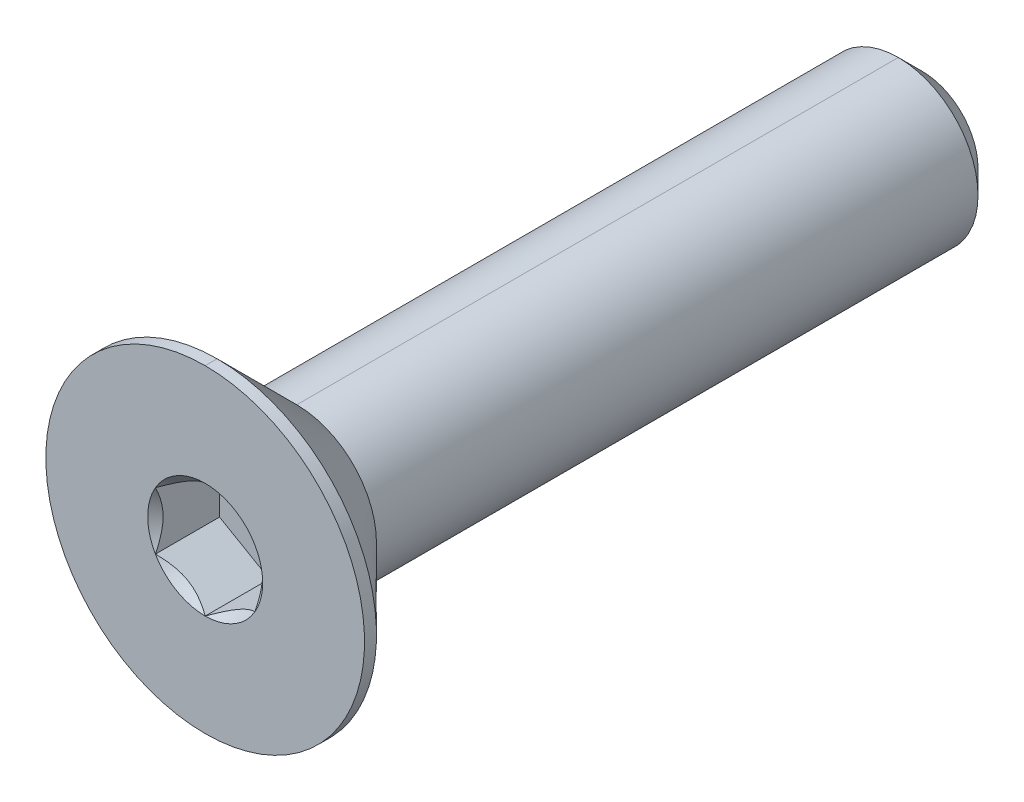
ISO-10303-21;
HEADER;
FILE_DESCRIPTION(('STEP AP214'),'2;1');
FILE_NAME('part.step','',(''),(''),'','','');
FILE_SCHEMA(('AUTOMOTIVE_DESIGN { 1 0 10303 214 1 1 1 1 }'));
ENDSEC;
DATA;
#1=APPLICATION_CONTEXT('core data for automotive mechanical design processes');
#2=APPLICATION_PROTOCOL_DEFINITION('international standard','automotive_design',2000,#1);
#3=PRODUCT_CONTEXT('',#1,'mechanical');
#4=PRODUCT('Part','Part','',(#3));
#5=PRODUCT_RELATED_PRODUCT_CATEGORY('part','',(#4));
#6=PRODUCT_DEFINITION_FORMATION('','',#4);
#7=PRODUCT_DEFINITION_CONTEXT('part definition',#1,'design');
#8=PRODUCT_DEFINITION('design','',#6,#7);
#9=PRODUCT_DEFINITION_SHAPE('','',#8);
#10=(LENGTH_UNIT() NAMED_UNIT(*) SI_UNIT(.MILLI.,.METRE.));
#11=(NAMED_UNIT(*) PLANE_ANGLE_UNIT() SI_UNIT($,.RADIAN.));
#12=(NAMED_UNIT(*) SI_UNIT($,.STERADIAN.) SOLID_ANGLE_UNIT());
#13=UNCERTAINTY_MEASURE_WITH_UNIT(LENGTH_MEASURE(1.E-05),#10,'distance_accuracy_value','');
#14=(GEOMETRIC_REPRESENTATION_CONTEXT(3) GLOBAL_UNCERTAINTY_ASSIGNED_CONTEXT((#13)) GLOBAL_UNIT_ASSIGNED_CONTEXT((#10,
#11,#12)) REPRESENTATION_CONTEXT('',''));
#15=CARTESIAN_POINT('',(0.,0.,0.));
#16=DIRECTION('',(0.,0.,1.));
#17=DIRECTION('',(1.,0.,0.));
#18=AXIS2_PLACEMENT_3D('',#15,#16,#17);
#19=CARTESIAN_POINT('',(0.,0.,9.));
#20=DIRECTION('',(0.,0.,1.));
#21=DIRECTION('',(1.,0.,0.));
#22=AXIS2_PLACEMENT_3D('',#19,#20,#21);
#23=CONICAL_SURFACE('',#22,1.44337567297406,0.78539816339745);
#24=CARTESIAN_POINT('',(0.,1.44337567297407,9.));
#25=CARTESIAN_POINT('',(0.0253962062772441,1.42871173939538,8.98534017344977));
#26=CARTESIAN_POINT('',(0.051025697636328,1.41390821556327,8.97120285583119));
#27=CARTESIAN_POINT('',(0.10185264126638,1.38455135148814,8.94467796047015));
#28=CARTESIAN_POINT('',(0.127032720413157,1.3700080230413,8.93224586501801));
#29=CARTESIAN_POINT('',(0.177081701669524,1.34111080255659,8.90912487306404));
#30=CARTESIAN_POINT('',(0.201935690514344,1.32676522024172,8.89839360591218));
#31=CARTESIAN_POINT('',(0.25146253920529,1.29818727047121,8.8786765587831));
#32=CARTESIAN_POINT('',(0.276124071878939,1.28396122168207,8.8696534859));
#33=CARTESIAN_POINT('',(0.31452641800861,1.26178056656594,8.85692893897715));
#34=CARTESIAN_POINT('',(0.328136143311492,1.25391439326372,8.8526727508192));
#35=CARTESIAN_POINT('',(0.355229451392081,1.23824608018625,8.84472997992978));
#36=CARTESIAN_POINT('',(0.368711226503257,1.2304451365734,8.84103492017969));
#37=CARTESIAN_POINT('',(0.395584933976844,1.21489851618412,8.83421571559464));
#38=CARTESIAN_POINT('',(0.408975452422273,1.20715361127104,8.83108425485051));
#39=CARTESIAN_POINT('',(0.435700897895861,1.19170446214963,8.82539033599572));
#40=CARTESIAN_POINT('',(0.449034857317323,1.18400068549077,8.82282208479103));
#41=CARTESIAN_POINT('',(0.475681276528109,1.16861644528848,8.81825316135381));
#42=CARTESIAN_POINT('',(0.48899318756872,1.16093621958652,8.81624849760021));
#43=CARTESIAN_POINT('',(0.515628569335448,1.1455779145886,8.8128046644906));
#44=CARTESIAN_POINT('',(0.528951836856391,1.13789992170302,8.8113635421712));
#45=CARTESIAN_POINT('',(0.55564234252192,1.1225220212383,8.80904523720888));
#46=CARTESIAN_POINT('',(0.569009596947596,1.1148221057322,8.80816829450218));
#47=CARTESIAN_POINT('',(0.595817844537591,1.09937057070431,8.8069740767474));
#48=CARTESIAN_POINT('',(0.609258902931849,1.09161887291294,8.80665928676263));
#49=CARTESIAN_POINT('',(0.636054452770437,1.07615046580358,8.80659521746844));
#50=CARTESIAN_POINT('',(0.649408976697644,1.0684338279729,8.80684253373492));
#51=CARTESIAN_POINT('',(0.676066182787152,1.05303545315484,8.80790893010388));
#52=CARTESIAN_POINT('',(0.689368906228141,1.04535367864985,8.80872642828909));
#53=CARTESIAN_POINT('',(0.71596024455312,1.03000750613394,8.81092883063313));
#54=CARTESIAN_POINT('',(0.729248819096024,1.022343143325,8.81231446543181));
#55=CARTESIAN_POINT('',(0.755848733765951,1.00701331189659,8.81565134115995));
#56=CARTESIAN_POINT('',(0.769159822872786,0.999348051623459,8.81760553341166));
#57=CARTESIAN_POINT('',(0.795839026849609,0.983994593890452,8.82207725389689));
#58=CARTESIAN_POINT('',(0.809206551473541,0.976306826796834,8.82459976623489));
#59=CARTESIAN_POINT('',(0.836030433544912,0.960883817247543,8.83020594809084));
#60=CARTESIAN_POINT('',(0.849485747047036,0.953149221289952,8.83329636920177));
#61=CARTESIAN_POINT('',(0.87651494201565,0.937606876871419,8.84003762359308));
#62=CARTESIAN_POINT('',(0.890087243379552,0.92979995626365,8.84369668033761));
#63=CARTESIAN_POINT('',(0.917375633781641,0.914080846260019,8.85157025043506));
#64=CARTESIAN_POINT('',(0.931089512921074,0.906169496813148,8.85579404361733));
#65=CARTESIAN_POINT('',(0.970039852544219,0.883668662016082,8.86851711600208));
#66=CARTESIAN_POINT('',(0.99512579099531,0.869139636793051,8.87758988234929));
#67=CARTESIAN_POINT('',(1.04544920087651,0.839994058447102,8.89744085354636));
#68=CARTESIAN_POINT('',(1.07067614496204,0.825383608034289,8.9082544157871));
#69=CARTESIAN_POINT('',(1.12142938776406,0.796003215878353,8.93157106751197));
#70=CARTESIAN_POINT('',(1.14694156254262,0.78124187520054,8.94411545023976));
#71=CARTESIAN_POINT('',(1.19839367046888,0.751491912393512,8.97089507014338));
#72=CARTESIAN_POINT('',(1.22431675063714,0.736513757528845,8.98517445787383));
#73=CARTESIAN_POINT('',(1.25,0.721687836487039,9.));
#74=B_SPLINE_CURVE_WITH_KNOTS('',3,(#24,#25,#26,#27,#28,#29,#30,#31,#32,#33,#34,#35,#36,#37,#38,
#39,#40,#41,#42,#43,#44,#45,#46,#47,#48,#49,#50,#51,#52,#53,#54,#55,#56,#57,#58,#59,#60,#61,#62,
#63,#64,#65,#66,#67,#68,#69,#70,#71,#72,#73),.UNSPECIFIED.,.F.,.F.,(4,2,2,2,2,2,2,2,2,2,2,2,2,2,
2,2,2,2,2,2,2,2,2,2,4),(0.,0.0983661972934601,0.193211421660727,0.285089157764343,
0.374642306368989,0.423491865935605,0.471508249259108,0.518847537410274,0.565674322319022,
0.612160591590057,0.658484303052321,0.704827702218182,0.751375465487974,0.79764206173265,
0.843780803535172,0.889979068113249,0.93642155729171,0.983288395797251,1.03075343788103,
1.07898286243241,1.12813410356451,1.21921525270593,1.31245749510235,1.40852753786428,
1.50800018713207),.UNSPECIFIED.);
#75=CARTESIAN_POINT('',(0.,1.44337567297407,9.));
#76=VERTEX_POINT('',#75);
#77=CARTESIAN_POINT('',(1.25,0.721687836487039,9.));
#78=VERTEX_POINT('',#77);
#79=EDGE_CURVE('E693',#76,#78,#74,.T.);
#80=ORIENTED_EDGE('',*,*,#79,.T.);
#81=CARTESIAN_POINT('',(0.,0.,9.));
#82=DIRECTION('',(0.,0.,1.));
#83=DIRECTION('',(1.,0.,0.));
#84=AXIS2_PLACEMENT_3D('',#81,#82,#83);
#85=CIRCLE('',#84,1.44337567297406);
#86=EDGE_CURVE('E183',#78,#76,#85,.T.);
#87=ORIENTED_EDGE('',*,*,#86,.T.);
#88=EDGE_LOOP('',(#80,#87));
#89=FACE_BOUND('',#88,.T.);
#90=ADVANCED_FACE('F15',(#89),#23,.F.);
#91=CARTESIAN_POINT('',(0.,0.,9.));
#92=DIRECTION('',(0.,0.,1.));
#93=DIRECTION('',(1.,0.,0.));
#94=AXIS2_PLACEMENT_3D('',#91,#92,#93);
#95=CONICAL_SURFACE('',#94,1.44337567297406,0.78539816339745);
#96=CARTESIAN_POINT('',(-1.25,-0.721687836487021,9.));
#97=CARTESIAN_POINT('',(-1.24999872788529,-0.69213654778458,8.98522748872684));
#98=CARTESIAN_POINT('',(-1.24999292132122,-0.662309206776891,8.97098521795377));
#99=CARTESIAN_POINT('',(-1.24998193050169,-0.60316233993739,8.94427909897459));
#100=CARTESIAN_POINT('',(-1.24997673134818,-0.573863352445898,8.93176961075768));
#101=CARTESIAN_POINT('',(-1.24997524547517,-0.515634615633568,8.90852229969113));
#102=CARTESIAN_POINT('',(-1.24997868311047,-0.48672231796561,8.89774107477324));
#103=CARTESIAN_POINT('',(-1.24999358008267,-0.429112214247941,8.87795264012988));
#104=CARTESIAN_POINT('',(-1.25000483347911,-0.40042760879462,8.86890733031116));
#105=CARTESIAN_POINT('',(-1.24999738242329,-0.355858862897729,8.85620256871726));
#106=CARTESIAN_POINT('',(-1.24999004692363,-0.340135159435788,8.85197507733425));
#107=CARTESIAN_POINT('',(-1.24996755916747,-0.308829347908529,8.84409042944266));
#108=CARTESIAN_POINT('',(-1.24995254218589,-0.293249390048759,8.84042478470691));
#109=CARTESIAN_POINT('',(-1.24992539836196,-0.262195095998351,8.8336651858397));
#110=CARTESIAN_POINT('',(-1.24991323384715,-0.246722355439851,8.83056391729016));
#111=CARTESIAN_POINT('',(-1.24989633459076,-0.215845384547125,8.82493113810775));
#112=CARTESIAN_POINT('',(-1.24989152123761,-0.200442211230733,8.822393850632));
#113=CARTESIAN_POINT('',(-1.24989136166261,-0.169666036865271,8.81788756233859));
#114=CARTESIAN_POINT('',(-1.24989594752465,-0.154293617123322,8.81591460125972));
#115=CARTESIAN_POINT('',(-1.24991294760553,-0.123539603459818,8.81253500059749));
#116=CARTESIAN_POINT('',(-1.24992533506981,-0.108158219669015,8.81112645234014));
#117=CARTESIAN_POINT('',(-1.24995281607519,-0.0773460596479704,8.80887360704871));
#118=CARTESIAN_POINT('',(-1.24996791102917,-0.0619152617804686,8.80802960571176));
#119=CARTESIAN_POINT('',(-1.24999176536981,-0.030963474241291,8.80690344856759));
#120=CARTESIAN_POINT('',(-1.25000049582688,-0.0154423920415858,8.80662384817629));
#121=CARTESIAN_POINT('',(-1.24999950440626,0.0155924626689868,8.80662481060224));
#122=CARTESIAN_POINT('',(-1.24998979120314,0.0311062351852591,8.80690511008603));
#123=CARTESIAN_POINT('',(-1.24996490610343,0.0620454027735855,8.80803311536389));
#124=CARTESIAN_POINT('',(-1.24994975823008,0.0774708879324943,8.80887833795984));
#125=CARTESIAN_POINT('',(-1.2499225741517,0.108274457028532,8.81113376950202));
#126=CARTESIAN_POINT('',(-1.2499105367446,0.123652557001073,8.81254375964964));
#127=CARTESIAN_POINT('',(-1.24989448993372,0.15440206957481,8.81592646391588));
#128=CARTESIAN_POINT('',(-1.24989050927895,0.169773263233056,8.81790116460369));
#129=CARTESIAN_POINT('',(-1.24989189070849,0.200549081611275,8.82241113597499));
#130=CARTESIAN_POINT('',(-1.24989732208283,0.215953113319321,8.82495044311253));
#131=CARTESIAN_POINT('',(-1.24991522562095,0.246833932236427,8.83058745394996));
#132=CARTESIAN_POINT('',(-1.24992777476569,0.262309648570614,8.83369100651191));
#133=CARTESIAN_POINT('',(-1.24995531211753,0.293372031383122,8.84045544521042));
#134=CARTESIAN_POINT('',(-1.24997033284339,0.308957086749086,8.84412371304816));
#135=CARTESIAN_POINT('',(-1.24999189312524,0.340275337027741,8.85201359541061));
#136=CARTESIAN_POINT('',(-1.24999828001983,0.356006367280397,8.85624375314212));
#137=CARTESIAN_POINT('',(-1.25000317251282,0.400563765257216,8.86894768694223));
#138=CARTESIAN_POINT('',(-1.24999046724561,0.429230010404565,8.87798831760365));
#139=CARTESIAN_POINT('',(-1.24997445194639,0.486806931501115,8.89776813283248));
#140=CARTESIAN_POINT('',(-1.24997139675151,0.515704338809975,8.90854560885997));
#141=CARTESIAN_POINT('',(-1.2499740430832,0.573907117771955,8.93178565057942));
#142=CARTESIAN_POINT('',(-1.24998003394314,0.603194976172705,8.94429176398511));
#143=CARTESIAN_POINT('',(-1.24999236543854,0.662323475715943,8.97099154813138));
#144=CARTESIAN_POINT('',(-1.24999871075766,0.692143523752263,8.9852309775765));
#145=CARTESIAN_POINT('',(-1.25000000000001,0.721687836487027,9.));
#146=B_SPLINE_CURVE_WITH_KNOTS('',3,(#96,#97,#98,#99,#100,#101,#102,#103,#104,#105,#106,#107,
#108,#109,#110,#111,#112,#113,#114,#115,#116,#117,#118,#119,#120,#121,#122,#123,#124,#125,#126,
#127,#128,#129,#130,#131,#132,#133,#134,#135,#136,#137,#138,#139,#140,#141,#142,#143,#144,#145),
.UNSPECIFIED.,.F.,.F.,(4,2,2,2,2,2,2,2,2,2,2,2,2,2,2,2,2,2,2,2,2,2,2,2,4),(0.,
0.0991229911291927,0.194667691722845,0.287202039734873,0.377386338066351,0.426225758496327,
0.474233273464964,0.521565691511838,0.568388313513595,0.614873801167627,0.661200734675484,
0.707551914239239,0.754112489694269,0.800651171822374,0.846986620401297,0.893304135334576,
0.939786636284325,0.986612790253435,1.03395531388891,1.08197953449218,1.13084226374104,
1.22096983975361,1.31345840493592,1.40896847216221,1.50806808094352),.UNSPECIFIED.);
#147=CARTESIAN_POINT('',(-1.25,-0.721687836487023,9.));
#148=VERTEX_POINT('',#147);
#149=CARTESIAN_POINT('',(-1.25,0.721687836487029,9.));
#150=VERTEX_POINT('',#149);
#151=EDGE_CURVE('E322',#148,#150,#146,.T.);
#152=ORIENTED_EDGE('',*,*,#151,.T.);
#153=CARTESIAN_POINT('',(0.,0.,9.));
#154=DIRECTION('',(0.,0.,1.));
#155=DIRECTION('',(1.,0.,0.));
#156=AXIS2_PLACEMENT_3D('',#153,#154,#155);
#157=CIRCLE('',#156,1.44337567297406);
#158=EDGE_CURVE('E266',#150,#148,#157,.T.);
#159=ORIENTED_EDGE('',*,*,#158,.T.);
#160=EDGE_LOOP('',(#152,#159));
#161=FACE_BOUND('',#160,.T.);
#162=ADVANCED_FACE('F380',(#161),#95,.F.);
#163=CARTESIAN_POINT('',(0.,0.,9.));
#164=DIRECTION('',(0.,0.,1.));
#165=DIRECTION('',(1.,0.,0.));
#166=AXIS2_PLACEMENT_3D('',#163,#164,#165);
#167=CONICAL_SURFACE('',#166,1.44337567297406,0.78539816339745);
#168=CARTESIAN_POINT('',(1.24999999999999,-0.721687836487033,9.));
#169=CARTESIAN_POINT('',(1.22460255786286,-0.736349629493498,8.9853401734498));
#170=CARTESIAN_POINT('',(1.19896758447923,-0.751143658180467,8.97120285583125));
#171=CARTESIAN_POINT('',(1.14813032259977,-0.780482650523231,8.94467796047024));
#172=CARTESIAN_POINT('',(1.12294539113585,-0.795017574510224,8.93224586501811));
#173=CARTESIAN_POINT('',(1.07289517346915,-0.82391265346942,8.90912487306415));
#174=CARTESIAN_POINT('',(1.04804454032996,-0.838264048036984,8.89839360591227));
#175=CARTESIAN_POINT('',(0.998531885495097,-0.866866582287511,8.87867655878317));
#176=CARTESIAN_POINT('',(0.973880999511355,-0.881111071684605,8.86965348590005));
#177=CARTESIAN_POINT('',(0.935470815642815,-0.903278151440018,8.85692893897698));
#178=CARTESIAN_POINT('',(0.921853647080571,-0.911131432639992,8.85267275081886));
#179=CARTESIAN_POINT('',(0.894737835879859,-0.926760769172012,8.84472997992914));
#180=CARTESIAN_POINT('',(0.88124113298168,-0.93453585710012,8.84103492017893));
#181=CARTESIAN_POINT('',(0.854340511044168,-0.950035860271676,8.83421571559368));
#182=CARTESIAN_POINT('',(0.840937967416594,-0.957759936958774,8.83108425484946));
#183=CARTESIAN_POINT('',(0.81419588907349,-0.97318027710569,8.82539033599458));
#184=CARTESIAN_POINT('',(0.800857243071013,-0.980875936368255,8.82282208478986));
#185=CARTESIAN_POINT('',(0.774210890632497,-0.99626029222345,8.81825316135265));
#186=CARTESIAN_POINT('',(0.760903664547555,-1.00394863250648,8.81624849759907));
#187=CARTESIAN_POINT('',(0.734285291377201,-1.01933639725682,8.81280466448956));
#188=CARTESIAN_POINT('',(0.720974320727962,-1.02703568894847,8.81136354217022));
#189=CARTESIAN_POINT('',(0.694311415436468,-1.04246139466206,8.8090452372081));
#190=CARTESIAN_POINT('',(0.68095946578873,-1.05018781882036,8.80816829450152));
#191=CARTESIAN_POINT('',(0.65417392013303,-1.06567867475004,8.80697407674705));
#192=CARTESIAN_POINT('',(0.640740223726656,-1.07344312387741,8.80665928676246));
#193=CARTESIAN_POINT('',(0.613946415295367,-1.08891454719127,8.80659521746863));
#194=CARTESIAN_POINT('',(0.600586348938845,-1.09662158525242,8.8068425337353));
#195=CARTESIAN_POINT('',(0.573922362125068,-1.11200821551095,8.80790893010457));
#196=CARTESIAN_POINT('',(0.560618388537281,-1.11968782469794,8.8087264282899));
#197=CARTESIAN_POINT('',(0.534032544125423,-1.13504351295015,8.81092883063413));
#198=CARTESIAN_POINT('',(0.520750723957705,-1.14271957467997,8.81231446543288));
#199=CARTESIAN_POINT('',(0.494174743170131,-1.1580908608085,8.81565134116113));
#200=CARTESIAN_POINT('',(0.480880888493596,-1.16578597199053,8.81760553341286));
#201=CARTESIAN_POINT('',(0.454244802072461,-1.18121411152073,8.82207725389809));
#202=CARTESIAN_POINT('',(0.440903238159006,-1.18894684388397,8.82459976623606));
#203=CARTESIAN_POINT('',(0.414134579050682,-1.20446550241122,8.83020594809191));
#204=CARTESIAN_POINT('',(0.400708565712233,-1.21225084774112,8.83329636920276));
#205=CARTESIAN_POINT('',(0.373733903126842,-1.22788764501842,8.84003762359388));
#206=CARTESIAN_POINT('',(0.360186760873073,-1.23573814248343,8.8436966803383));
#207=CARTESIAN_POINT('',(0.332929417083593,-1.25151102679801,8.85157025043543));
#208=CARTESIAN_POINT('',(0.319221047914423,-1.25943191979362,8.8557940436175));
#209=CARTESIAN_POINT('',(0.280259583562861,-1.2819134859937,8.86851711600138));
#210=CARTESIAN_POINT('',(0.25513410940285,-1.29637403335776,8.87758988234791));
#211=CARTESIAN_POINT('',(0.204731593207998,-1.32538259554594,8.89744085354408));
#212=CARTESIAN_POINT('',(0.17946509994744,-1.33992454477728,8.90825441578464));
#213=CARTESIAN_POINT('',(0.128644312566422,-1.36918794629047,8.93157106750952));
#214=CARTESIAN_POINT('',(0.103104529156,-1.38390146741592,8.94411545023755));
#215=CARTESIAN_POINT('',(0.0516142516390417,-1.41358531855588,8.97089507014206));
#216=CARTESIAN_POINT('',(0.0256812489392433,-1.42854628709435,8.98517445787319));
#217=CARTESIAN_POINT('',(0.,-1.44337567297406,9.));
#218=B_SPLINE_CURVE_WITH_KNOTS('',3,(#168,#169,#170,#171,#172,#173,#174,#175,#176,#177,#178,
#179,#180,#181,#182,#183,#184,#185,#186,#187,#188,#189,#190,#191,#192,#193,#194,#195,#196,#197,
#198,#199,#200,#201,#202,#203,#204,#205,#206,#207,#208,#209,#210,#211,#212,#213,#214,#215,#216,
#217),.UNSPECIFIED.,.F.,.F.,(4,2,2,2,2,2,2,2,2,2,2,2,2,2,2,2,2,2,2,2,2,2,2,2,4),(0.,
0.0983661972932898,0.193211421660505,0.28508915776418,0.374642306368984,0.423491865937386,
0.471508249262136,0.518847537414019,0.565674322322974,0.612160591593725,0.658484303055239,
0.704827702219906,0.751375465488091,0.797642061732247,0.843780803534444,0.889979068112363,
0.936421557290805,0.98328839579644,1.0307534378804,1.07898286243202,1.12813410356439,
1.21921525270173,1.31245749509664,1.40852753785989,1.50800018713202),.UNSPECIFIED.);
#219=CARTESIAN_POINT('',(1.25,-0.721687836487038,9.));
#220=VERTEX_POINT('',#219);
#221=CARTESIAN_POINT('',(0.,-1.44337567297406,9.));
#222=VERTEX_POINT('',#221);
#223=EDGE_CURVE('E143',#220,#222,#218,.T.);
#224=ORIENTED_EDGE('',*,*,#223,.T.);
#225=CARTESIAN_POINT('',(0.,0.,9.));
#226=DIRECTION('',(0.,0.,1.));
#227=DIRECTION('',(1.,0.,0.));
#228=AXIS2_PLACEMENT_3D('',#225,#226,#227);
#229=CIRCLE('',#228,1.44337567297406);
#230=EDGE_CURVE('E182',#222,#220,#229,.T.);
#231=ORIENTED_EDGE('',*,*,#230,.T.);
#232=EDGE_LOOP('',(#224,#231));
#233=FACE_BOUND('',#232,.T.);
#234=ADVANCED_FACE('F17',(#233),#167,.F.);
#235=CARTESIAN_POINT('',(0.,0.,9.));
#236=DIRECTION('',(0.,0.,1.));
#237=DIRECTION('',(1.,0.,0.));
#238=AXIS2_PLACEMENT_3D('',#235,#236,#237);
#239=CONICAL_SURFACE('',#238,1.44337567297406,0.78539816339745);
#240=DIRECTION('',(0.707106781186549,0.,0.707106781186546));
#241=VECTOR('',#240,1.);
#242=CARTESIAN_POINT('',(1.44337567297406,0.,9.));
#243=LINE('',#242,#241);
#244=CARTESIAN_POINT('',(1.25,0.,8.80662432702594));
#245=VERTEX_POINT('',#244);
#246=CARTESIAN_POINT('',(1.44337567297406,0.,9.));
#247=VERTEX_POINT('',#246);
#248=EDGE_CURVE('E717',#245,#247,#243,.T.);
#249=ORIENTED_EDGE('',*,*,#248,.F.);
#250=CARTESIAN_POINT('',(1.25,0.,8.80662432702593));
#251=CARTESIAN_POINT('',(1.24999937006651,-0.0155143053636593,8.80662271599467));
#252=CARTESIAN_POINT('',(1.24999067027202,-0.031028787753053,8.80690379438773));
#253=CARTESIAN_POINT('',(1.24996683196452,-0.0619686911231946,8.80803149743819));
#254=CARTESIAN_POINT('',(1.24995172199501,-0.0773942032874053,8.80887562435361));
#255=CARTESIAN_POINT('',(1.2499245949841,-0.10819723300111,8.81112905722234));
#256=CARTESIAN_POINT('',(1.24991257661502,-0.123574768341904,8.81253811989818));
#257=CARTESIAN_POINT('',(1.24989638155233,-0.154322498038325,8.81591862005473));
#258=CARTESIAN_POINT('',(1.24989223258205,-0.169692476432225,8.81789201766427));
#259=CARTESIAN_POINT('',(1.24989322384107,-0.200465192001379,8.82239917952806));
#260=CARTESIAN_POINT('',(1.24989843253147,-0.215867340427316,8.82493695367273));
#261=CARTESIAN_POINT('',(1.2499158968785,-0.246743690744896,8.83057066042715));
#262=CARTESIAN_POINT('',(1.24992822927781,-0.262216827088442,8.83367241529552));
#263=CARTESIAN_POINT('',(1.24995540077381,-0.293273328100694,8.84043301515297));
#264=CARTESIAN_POINT('',(1.24997027330461,-0.308855087886816,8.84409921621392));
#265=CARTESIAN_POINT('',(1.24999174643323,-0.340165985062837,8.85198477586509));
#266=CARTESIAN_POINT('',(1.249998198484,-0.355892964228581,8.85621265486835));
#267=CARTESIAN_POINT('',(1.25000332495074,-0.400456727909326,8.86891494088704));
#268=CARTESIAN_POINT('',(1.24999080837305,-0.429133209528551,8.8779569947233));
#269=CARTESIAN_POINT('',(1.24997492918759,-0.486730228824434,8.89774053519781));
#270=CARTESIAN_POINT('',(1.24997181483553,-0.51563749791395,8.9085203188804));
#271=CARTESIAN_POINT('',(1.24997431976395,-0.573859740056194,8.9317659431433));
#272=CARTESIAN_POINT('',(1.24998022761259,-0.603157193097406,8.94427535243596));
#273=CARTESIAN_POINT('',(1.24999242252367,-0.662304756321053,8.97098266488871));
#274=CARTESIAN_POINT('',(1.24999871549367,-0.692134261899904,8.98522635422189));
#275=CARTESIAN_POINT('',(1.24999999999999,-0.721687836487033,9.));
#276=B_SPLINE_CURVE_WITH_KNOTS('',3,(#250,#251,#252,#253,#254,#255,#256,#257,#258,#259,#260,
#261,#262,#263,#264,#265,#266,#267,#268,#269,#270,#271,#272,#273,#274,#275),.UNSPECIFIED.,.F.,
.F.,(4,2,2,2,2,2,2,2,2,2,2,2,4),(0.,0.0465405702459249,0.0928760427056699,0.139191583182668,
0.185669989070422,0.2324898191104,0.279823696754431,0.327836871136763,0.376686089809155,
0.466844182220993,0.559362852392078,0.654903241343504,0.754033918976996),.UNSPECIFIED.);
#277=EDGE_CURVE('E156',#245,#220,#276,.T.);
#278=ORIENTED_EDGE('',*,*,#277,.T.);
#279=CARTESIAN_POINT('',(0.,0.,9.));
#280=DIRECTION('',(0.,0.,1.));
#281=DIRECTION('',(1.,0.,0.));
#282=AXIS2_PLACEMENT_3D('',#279,#280,#281);
#283=CIRCLE('',#282,1.44337567297406);
#284=EDGE_CURVE('E179',#220,#247,#283,.T.);
#285=ORIENTED_EDGE('',*,*,#284,.T.);
#286=EDGE_LOOP('',(#249,#278,#285));
#287=FACE_BOUND('',#286,.T.);
#288=ADVANCED_FACE('F193',(#287),#239,.F.);
#289=CARTESIAN_POINT('',(0.,0.,9.));
#290=DIRECTION('',(0.,0.,1.));
#291=DIRECTION('',(1.,0.,0.));
#292=AXIS2_PLACEMENT_3D('',#289,#290,#291);
#293=CONICAL_SURFACE('',#292,1.44337567297406,0.78539816339745);
#294=CARTESIAN_POINT('',(0.,-1.44337567297406,9.));
#295=CARTESIAN_POINT('',(-0.0253962062763526,-1.42871173939588,8.98534017345029));
#296=CARTESIAN_POINT('',(-0.0510256976345967,-1.41390821556437,8.97120285583227));
#297=CARTESIAN_POINT('',(-0.101852641263605,-1.38455135149012,8.94467796047194));
#298=CARTESIAN_POINT('',(-0.12703272041019,-1.37000802304355,8.93224586501999));
#299=CARTESIAN_POINT('',(-0.177081701666703,-1.34111080255897,8.90912487306604));
#300=CARTESIAN_POINT('',(-0.201935690511875,-1.32676522024396,8.89839360591403));
#301=CARTESIAN_POINT('',(-0.251462539203888,-1.29818727047264,8.87867655878423));
#302=CARTESIAN_POINT('',(-0.276124071878268,-1.28396122168282,8.86965348590059));
#303=CARTESIAN_POINT('',(-0.314526418008553,-1.26178056656578,8.856928938977));
#304=CARTESIAN_POINT('',(-0.328136143311347,-1.25391439326338,8.85267275081885));
#305=CARTESIAN_POINT('',(-0.355229451391794,-1.23824608018562,8.84472997992911));
#306=CARTESIAN_POINT('',(-0.368711226502913,-1.23044513657267,8.8410349201789));
#307=CARTESIAN_POINT('',(-0.395584933976398,-1.21489851618321,8.83421571559366));
#308=CARTESIAN_POINT('',(-0.408975452421782,-1.20715361127007,8.83108425484945));
#309=CARTESIAN_POINT('',(-0.4357008978953,-1.19170446214858,8.82539033599455));
#310=CARTESIAN_POINT('',(-0.449034857316738,-1.1840006854897,8.82282208478984));
#311=CARTESIAN_POINT('',(-0.475681276527502,-1.16861644528743,8.81825316135263));
#312=CARTESIAN_POINT('',(-0.488993187568113,-1.16093621958549,8.81624849759905));
#313=CARTESIAN_POINT('',(-0.515628569334874,-1.14557791458767,8.81280466448954));
#314=CARTESIAN_POINT('',(-0.528951836855848,-1.13789992170217,8.81136354217021));
#315=CARTESIAN_POINT('',(-0.555642342521472,-1.12252202123762,8.80904523720809));
#316=CARTESIAN_POINT('',(-0.569009596947212,-1.11482210573163,8.80816829450151));
#317=CARTESIAN_POINT('',(-0.595817844537382,-1.099370570704,8.80697407674704));
#318=CARTESIAN_POINT('',(-0.609258902931751,-1.09161887291278,8.80665928676246));
#319=CARTESIAN_POINT('',(-0.636054452770962,-1.07615046580348,8.80659521746863));
#320=CARTESIAN_POINT('',(-0.64940897669868,-1.0684338279727,8.8068425337353));
#321=CARTESIAN_POINT('',(-0.676066182789051,-1.05303545315442,8.80790893010456));
#322=CARTESIAN_POINT('',(-0.689368906230391,-1.04535367864932,8.8087264282899));
#323=CARTESIAN_POINT('',(-0.715960244555929,-1.03000750613319,8.81092883063413));
#324=CARTESIAN_POINT('',(-0.729248819099038,-1.02234314332415,8.81231446543288));
#325=CARTESIAN_POINT('',(-0.755848733769232,-1.00701331189557,8.81565134116112));
#326=CARTESIAN_POINT('',(-0.769159822876126,-0.999348051622374,8.81760553341285));
#327=CARTESIAN_POINT('',(-0.795839026852928,-0.983994593889279,8.82207725389808));
#328=CARTESIAN_POINT('',(-0.809206551476779,-0.976306826795641,8.82459976623605));
#329=CARTESIAN_POINT('',(-0.83603043354785,-0.960883817246375,8.8302059480919));
#330=CARTESIAN_POINT('',(-0.849485747049755,-0.953149221288829,8.83329636920275));
#331=CARTESIAN_POINT('',(-0.876514942017796,-0.937606876870466,8.84003762359387));
#332=CARTESIAN_POINT('',(-0.890087243381345,-0.929799956262822,8.84369668033827));
#333=CARTESIAN_POINT('',(-0.9173756337826,-0.914080846259545,8.85157025043542));
#334=CARTESIAN_POINT('',(-0.931089512921551,-0.906169496812904,8.85579404361752));
#335=CARTESIAN_POINT('',(-0.970039852544092,-0.883668662016089,8.86851711600201));
#336=CARTESIAN_POINT('',(-0.995125790995066,-0.869139636793105,8.87758988234915));
#337=CARTESIAN_POINT('',(-1.04544920087611,-0.839994058447228,8.89744085354614));
#338=CARTESIAN_POINT('',(-1.0706761449616,-0.825383608034441,8.90825441578686));
#339=CARTESIAN_POINT('',(-1.12142938776363,-0.796003215878526,8.93157106751172));
#340=CARTESIAN_POINT('',(-1.14694156254223,-0.781241875200708,8.94411545023954));
#341=CARTESIAN_POINT('',(-1.19839367046865,-0.751491912393619,8.97089507014325));
#342=CARTESIAN_POINT('',(-1.22431675063703,-0.736513757528897,8.98517445787377));
#343=CARTESIAN_POINT('',(-1.25,-0.721687836487021,9.));
#344=B_SPLINE_CURVE_WITH_KNOTS('',3,(#294,#295,#296,#297,#298,#299,#300,#301,#302,#303,#304,
#305,#306,#307,#308,#309,#310,#311,#312,#313,#314,#315,#316,#317,#318,#319,#320,#321,#322,#323,
#324,#325,#326,#327,#328,#329,#330,#331,#332,#333,#334,#335,#336,#337,#338,#339,#340,#341,#342,
#343),.UNSPECIFIED.,.F.,.F.,(4,2,2,2,2,2,2,2,2,2,2,2,2,2,2,2,2,2,2,2,2,2,2,2,4),(0.,
0.0983661972899734,0.193211421656181,0.285089157761007,0.374642306368928,0.423491865935736,
0.471508249259336,0.518847537410525,0.565674322319246,0.612160591590229,0.658484303052445,
0.70482770221829,0.751375465488125,0.79764206173429,0.843780803537923,0.889979068116702,
0.936421557295429,0.983288395800778,1.03075343788389,1.07898286243411,1.12813410356454,
1.21921525270554,1.3124574951018,1.40852753786387,1.5080001871321),.UNSPECIFIED.);
#345=EDGE_CURVE('E225',#222,#148,#344,.T.);
#346=ORIENTED_EDGE('',*,*,#345,.T.);
#347=CARTESIAN_POINT('',(0.,0.,9.));
#348=DIRECTION('',(0.,0.,1.));
#349=DIRECTION('',(1.,0.,0.));
#350=AXIS2_PLACEMENT_3D('',#347,#348,#349);
#351=CIRCLE('',#350,1.44337567297406);
#352=EDGE_CURVE('E263',#148,#222,#351,.T.);
#353=ORIENTED_EDGE('',*,*,#352,.T.);
#354=EDGE_LOOP('',(#346,#353));
#355=FACE_BOUND('',#354,.T.);
#356=ADVANCED_FACE('F202',(#355),#293,.F.);
#357=CARTESIAN_POINT('',(0.,0.,9.));
#358=DIRECTION('',(0.,0.,1.));
#359=DIRECTION('',(1.,0.,0.));
#360=AXIS2_PLACEMENT_3D('',#357,#358,#359);
#361=CONICAL_SURFACE('',#360,1.44337567297406,0.78539816339745);
#362=CARTESIAN_POINT('',(-1.25000000000001,0.721687836487027,9.));
#363=CARTESIAN_POINT('',(-1.22460255786334,0.736349629493226,8.98534017345006));
#364=CARTESIAN_POINT('',(-1.19896758448019,0.751143658179973,8.9712028558318));
#365=CARTESIAN_POINT('',(-1.14813032260137,0.780482650522495,8.94467796047115));
#366=CARTESIAN_POINT('',(-1.12294539113763,0.795017574509471,8.93224586501912));
#367=CARTESIAN_POINT('',(-1.07289517347094,0.823912653468769,8.90912487306517));
#368=CARTESIAN_POINT('',(-1.04804454033161,0.838264048036456,8.89839360591322));
#369=CARTESIAN_POINT('',(-0.998531885496103,0.86686658228724,8.87867655878374));
#370=CARTESIAN_POINT('',(-0.97388099951187,0.881111071684474,8.86965348590032));
#371=CARTESIAN_POINT('',(-0.935470815643299,0.903278151439652,8.85692893897707));
#372=CARTESIAN_POINT('',(-0.921853647081534,0.911131432639254,8.85267275081902));
#373=CARTESIAN_POINT('',(-0.894737835881665,0.926760769170691,8.84472997992944));
#374=CARTESIAN_POINT('',(-0.881241132983848,0.934535857098586,8.84103492017929));
#375=CARTESIAN_POINT('',(-0.85434051104693,0.950035860269832,8.83421571559414));
#376=CARTESIAN_POINT('',(-0.840937967419585,0.957759936956831,8.83108425484997));
#377=CARTESIAN_POINT('',(-0.814195889076803,0.973180277103654,8.82539033599513));
#378=CARTESIAN_POINT('',(-0.800857243074418,0.980875936366223,8.82282208479043));
#379=CARTESIAN_POINT('',(-0.77421089063594,0.996260292221511,8.81825316135321));
#380=CARTESIAN_POINT('',(-0.760903664550944,1.00394863250463,8.81624849759963));
#381=CARTESIAN_POINT('',(-0.73428529138033,1.01933639725521,8.81280466449006));
#382=CARTESIAN_POINT('',(-0.720974320730884,1.02703568894702,8.8113635421707));
#383=CARTESIAN_POINT('',(-0.69431141543882,1.04246139466097,8.80904523720848));
#384=CARTESIAN_POINT('',(-0.680959465790717,1.05018781881948,8.80816829450184));
#385=CARTESIAN_POINT('',(-0.654173920134118,1.06567867474959,8.80697407674721));
#386=CARTESIAN_POINT('',(-0.640740223727208,1.07344312387718,8.80665928676253));
#387=CARTESIAN_POINT('',(-0.613946415295208,1.08891454719126,8.80659521746854));
#388=CARTESIAN_POINT('',(-0.600586348938512,1.0966215852524,8.80684253373511));
#389=CARTESIAN_POINT('',(-0.57392236212444,1.11200821551091,8.80790893010422));
#390=CARTESIAN_POINT('',(-0.560618388536532,1.11968782469788,8.80872642828949));
#391=CARTESIAN_POINT('',(-0.53403254412448,1.13504351295006,8.81092883063363));
#392=CARTESIAN_POINT('',(-0.520750723956688,1.14271957467986,8.81231446543235));
#393=CARTESIAN_POINT('',(-0.494174743169017,1.15809086080835,8.81565134116054));
#394=CARTESIAN_POINT('',(-0.480880888492457,1.16578597199036,8.81760553341226));
#395=CARTESIAN_POINT('',(-0.45424480207132,1.18121411152055,8.82207725389749));
#396=CARTESIAN_POINT('',(-0.440903238157889,1.18894684388377,8.82459976623547));
#397=CARTESIAN_POINT('',(-0.414134579049661,1.20446550241102,8.83020594809137));
#398=CARTESIAN_POINT('',(-0.400708565711286,1.21225084774092,8.83329636920226));
#399=CARTESIAN_POINT('',(-0.373733903126086,1.22788764501824,8.84003762359348));
#400=CARTESIAN_POINT('',(-0.360186760872434,1.23573814248327,8.84369668033795));
#401=CARTESIAN_POINT('',(-0.332929417083252,1.25151102679792,8.85157025043524));
#402=CARTESIAN_POINT('',(-0.319221047914262,1.25943191979358,8.85579404361741));
#403=CARTESIAN_POINT('',(-0.28025958356238,1.28191348599424,8.86851711600177));
#404=CARTESIAN_POINT('',(-0.255134109401853,1.29637403335878,8.87758988234869));
#405=CARTESIAN_POINT('',(-0.204731593206243,1.32538259554754,8.89744085354538));
#406=CARTESIAN_POINT('',(-0.179465099945435,1.33992454477898,8.90825441578604));
#407=CARTESIAN_POINT('',(-0.128644312564312,1.36918794629208,8.93157106751091));
#408=CARTESIAN_POINT('',(-0.103104529154027,1.38390146741734,8.9441154502388));
#409=CARTESIAN_POINT('',(-0.0516142516378108,1.41358531855669,8.97089507014281));
#410=CARTESIAN_POINT('',(-0.0256812489386103,1.42854628709473,8.98517445787356));
#411=CARTESIAN_POINT('',(0.,1.44337567297407,9.));
#412=B_SPLINE_CURVE_WITH_KNOTS('',3,(#362,#363,#364,#365,#366,#367,#368,#369,#370,#371,#372,
#373,#374,#375,#376,#377,#378,#379,#380,#381,#382,#383,#384,#385,#386,#387,#388,#389,#390,#391,
#392,#393,#394,#395,#396,#397,#398,#399,#400,#401,#402,#403,#404,#405,#406,#407,#408,#409,#410,
#411),.UNSPECIFIED.,.F.,.F.,(4,2,2,2,2,2,2,2,2,2,2,2,2,2,2,2,2,2,2,2,2,2,2,2,4),(0.,
0.0983661972915028,0.193211421658178,0.285089157762475,0.374642306368964,0.42349186593557,
0.471508249259045,0.518847537410177,0.565674322318897,0.612160591589922,0.658484303052211,
0.704827702218144,0.751375465488069,0.797642061732653,0.843780803535133,0.889979068113203,
0.936421557291679,0.983288395797245,1.03075343788104,1.07898286243243,1.1281341035645,
1.21921525270417,1.31245749509994,1.40852753786244,1.5080001871321),.UNSPECIFIED.);
#413=EDGE_CURVE('E29',#150,#76,#412,.T.);
#414=ORIENTED_EDGE('',*,*,#413,.T.);
#415=CARTESIAN_POINT('',(0.,0.,9.));
#416=DIRECTION('',(0.,0.,1.));
#417=DIRECTION('',(1.,0.,0.));
#418=AXIS2_PLACEMENT_3D('',#415,#416,#417);
#419=CIRCLE('',#418,1.44337567297406);
#420=EDGE_CURVE('E275',#76,#150,#419,.T.);
#421=ORIENTED_EDGE('',*,*,#420,.T.);
#422=EDGE_LOOP('',(#414,#421));
#423=FACE_BOUND('',#422,.T.);
#424=ADVANCED_FACE('F206',(#423),#361,.F.);
#425=CARTESIAN_POINT('',(0.,0.,7.39));
#426=DIRECTION('',(0.,0.,1.));
#427=DIRECTION('',(1.,0.,0.));
#428=AXIS2_PLACEMENT_3D('',#425,#426,#427);
#429=PLANE('',#428);
#430=DIRECTION('',(-0.866025403784439,0.5,0.));
#431=VECTOR('',#430,1.);
#432=CARTESIAN_POINT('',(1.25,0.721687836487033,7.39));
#433=LINE('',#432,#431);
#434=CARTESIAN_POINT('',(1.25,0.721687836487033,7.39));
#435=VERTEX_POINT('',#434);
#436=CARTESIAN_POINT('',(0.,1.44337567297406,7.39));
#437=VERTEX_POINT('',#436);
#438=EDGE_CURVE('E163',#435,#437,#433,.T.);
#439=ORIENTED_EDGE('',*,*,#438,.T.);
#440=DIRECTION('',(-0.866025403784439,-0.5,0.));
#441=VECTOR('',#440,1.);
#442=CARTESIAN_POINT('',(0.,1.44337567297406,7.39));
#443=LINE('',#442,#441);
#444=CARTESIAN_POINT('',(-1.25,0.721687836487033,7.39));
#445=VERTEX_POINT('',#444);
#446=EDGE_CURVE('E10',#437,#445,#443,.T.);
#447=ORIENTED_EDGE('',*,*,#446,.T.);
#448=DIRECTION('',(0.,-1.,0.));
#449=VECTOR('',#448,1.);
#450=CARTESIAN_POINT('',(-1.25,0.721687836487033,7.39));
#451=LINE('',#450,#449);
#452=CARTESIAN_POINT('',(-1.25,-0.721687836487032,7.39));
#453=VERTEX_POINT('',#452);
#454=EDGE_CURVE('E812',#445,#453,#451,.T.);
#455=ORIENTED_EDGE('',*,*,#454,.T.);
#456=DIRECTION('',(0.866025403784439,-0.5,0.));
#457=VECTOR('',#456,1.);
#458=CARTESIAN_POINT('',(-1.25,-0.721687836487032,7.39));
#459=LINE('',#458,#457);
#460=CARTESIAN_POINT('',(0.,-1.44337567297406,7.39));
#461=VERTEX_POINT('',#460);
#462=EDGE_CURVE('E136',#453,#461,#459,.T.);
#463=ORIENTED_EDGE('',*,*,#462,.T.);
#464=DIRECTION('',(0.866025403784439,0.5,0.));
#465=VECTOR('',#464,1.);
#466=CARTESIAN_POINT('',(0.,-1.44337567297406,7.39));
#467=LINE('',#466,#465);
#468=CARTESIAN_POINT('',(1.25,-0.721687836487033,7.39));
#469=VERTEX_POINT('',#468);
#470=EDGE_CURVE('E130',#461,#469,#467,.T.);
#471=ORIENTED_EDGE('',*,*,#470,.T.);
#472=DIRECTION('',(0.,1.,0.));
#473=VECTOR('',#472,1.);
#474=CARTESIAN_POINT('',(1.25,-0.721687836487033,7.39));
#475=LINE('',#474,#473);
#476=EDGE_CURVE('E133',#469,#435,#475,.T.);
#477=ORIENTED_EDGE('',*,*,#476,.T.);
#478=EDGE_LOOP('',(#439,#447,#455,#463,#471,#477));
#479=FACE_BOUND('',#478,.T.);
#480=ADVANCED_FACE('F132',(#479),#429,.T.);
#481=CARTESIAN_POINT('',(0.,1.44337567297406,7.39));
#482=DIRECTION('',(-0.5,0.866025403784439,0.));
#483=DIRECTION('',(0.,0.,1.));
#484=AXIS2_PLACEMENT_3D('',#481,#482,#483);
#485=PLANE('',#484);
#486=DIRECTION('',(0.,0.,1.));
#487=VECTOR('',#486,1.);
#488=CARTESIAN_POINT('',(0.,1.44337567297406,7.39));
#489=LINE('',#488,#487);
#490=EDGE_CURVE('E170',#437,#76,#489,.T.);
#491=ORIENTED_EDGE('',*,*,#490,.T.);
#492=ORIENTED_EDGE('',*,*,#413,.F.);
#493=DIRECTION('',(0.,0.,1.));
#494=VECTOR('',#493,1.);
#495=CARTESIAN_POINT('',(-1.25,0.721687836487033,7.39));
#496=LINE('',#495,#494);
#497=EDGE_CURVE('E316',#445,#150,#496,.T.);
#498=ORIENTED_EDGE('',*,*,#497,.F.);
#499=ORIENTED_EDGE('',*,*,#446,.F.);
#500=EDGE_LOOP('',(#491,#492,#498,#499));
#501=FACE_BOUND('',#500,.T.);
#502=ADVANCED_FACE('F245',(#501),#485,.F.);
#503=CARTESIAN_POINT('',(-1.25,0.721687836487033,7.39));
#504=DIRECTION('',(-1.,0.,0.));
#505=DIRECTION('',(0.,0.,1.));
#506=AXIS2_PLACEMENT_3D('',#503,#504,#505);
#507=PLANE('',#506);
#508=ORIENTED_EDGE('',*,*,#497,.T.);
#509=ORIENTED_EDGE('',*,*,#151,.F.);
#510=DIRECTION('',(0.,0.,1.));
#511=VECTOR('',#510,1.);
#512=CARTESIAN_POINT('',(-1.25,-0.721687836487032,7.39));
#513=LINE('',#512,#511);
#514=EDGE_CURVE('E142',#453,#148,#513,.T.);
#515=ORIENTED_EDGE('',*,*,#514,.F.);
#516=ORIENTED_EDGE('',*,*,#454,.F.);
#517=EDGE_LOOP('',(#508,#509,#515,#516));
#518=FACE_BOUND('',#517,.T.);
#519=ADVANCED_FACE('F240',(#518),#507,.F.);
#520=CARTESIAN_POINT('',(-1.25,-0.721687836487032,7.39));
#521=DIRECTION('',(-0.5,-0.866025403784439,0.));
#522=DIRECTION('',(-0.866025403784439,0.5,0.));
#523=AXIS2_PLACEMENT_3D('',#520,#521,#522);
#524=PLANE('',#523);
#525=ORIENTED_EDGE('',*,*,#514,.T.);
#526=ORIENTED_EDGE('',*,*,#345,.F.);
#527=DIRECTION('',(0.,0.,1.));
#528=VECTOR('',#527,1.);
#529=CARTESIAN_POINT('',(0.,-1.44337567297406,7.39));
#530=LINE('',#529,#528);
#531=EDGE_CURVE('E155',#461,#222,#530,.T.);
#532=ORIENTED_EDGE('',*,*,#531,.F.);
#533=ORIENTED_EDGE('',*,*,#462,.F.);
#534=EDGE_LOOP('',(#525,#526,#532,#533));
#535=FACE_BOUND('',#534,.T.);
#536=ADVANCED_FACE('F231',(#535),#524,.F.);
#537=CARTESIAN_POINT('',(0.,-1.44337567297406,7.39));
#538=DIRECTION('',(0.5,-0.866025403784439,0.));
#539=DIRECTION('',(0.,0.,-1.));
#540=AXIS2_PLACEMENT_3D('',#537,#538,#539);
#541=PLANE('',#540);
#542=ORIENTED_EDGE('',*,*,#531,.T.);
#543=ORIENTED_EDGE('',*,*,#223,.F.);
#544=DIRECTION('',(0.,0.,1.));
#545=VECTOR('',#544,1.);
#546=CARTESIAN_POINT('',(1.25,-0.721687836487033,7.39));
#547=LINE('',#546,#545);
#548=EDGE_CURVE('E149',#469,#220,#547,.T.);
#549=ORIENTED_EDGE('',*,*,#548,.F.);
#550=ORIENTED_EDGE('',*,*,#470,.F.);
#551=EDGE_LOOP('',(#542,#543,#549,#550));
#552=FACE_BOUND('',#551,.T.);
#553=ADVANCED_FACE('F158',(#552),#541,.F.);
#554=CARTESIAN_POINT('',(1.25,-0.721687836487033,7.39));
#555=DIRECTION('',(1.,0.,0.));
#556=DIRECTION('',(0.,-1.,0.));
#557=AXIS2_PLACEMENT_3D('',#554,#555,#556);
#558=PLANE('',#557);
#559=ORIENTED_EDGE('',*,*,#548,.T.);
#560=ORIENTED_EDGE('',*,*,#277,.F.);
#561=CARTESIAN_POINT('',(1.25,0.721687836487039,9.));
#562=CARTESIAN_POINT('',(1.24999872315044,0.69214580628291,8.9852321104167));
#563=CARTESIAN_POINT('',(1.24999286448695,0.662327919287104,8.97099409816517));
#564=CARTESIAN_POINT('',(1.24998173770017,0.603200106145864,8.94429550396314));
#565=CARTESIAN_POINT('',(1.24997645589292,0.573910706821352,8.93178930951197));
#566=CARTESIAN_POINT('',(1.24997482914298,0.515701417361841,8.9085475760428));
#567=CARTESIAN_POINT('',(1.24997820780171,0.486798972090452,8.89776865600846));
#568=CARTESIAN_POINT('',(1.24999324037357,0.429208945017971,8.87798393993349));
#569=CARTESIAN_POINT('',(1.25000468183844,0.400534563818669,8.86894004949617));
#570=CARTESIAN_POINT('',(1.2499974629867,0.355972178041814,8.8562336393958));
#571=CARTESIAN_POINT('',(1.2499901915551,0.340244430269197,8.85200387149015));
#572=CARTESIAN_POINT('',(1.24996761481603,0.308931278199827,8.84411490403729));
#573=CARTESIAN_POINT('',(1.24995244884157,0.293348030547991,8.84044719347111));
#574=CARTESIAN_POINT('',(1.2499249396001,0.26228786574189,8.83368376159973));
#575=CARTESIAN_POINT('',(1.24991255952647,0.246812550439055,8.83058070019739));
#576=CARTESIAN_POINT('',(1.24989521758639,0.215931119641812,8.82494461054864));
#577=CARTESIAN_POINT('',(1.24989017692161,0.200526066495103,8.82240577904296));
#578=CARTESIAN_POINT('',(1.24988964071628,0.16974679918341,8.817896716754));
#579=CARTESIAN_POINT('',(1.24989407626866,0.154373170551582,8.81592249875457));
#580=CARTESIAN_POINT('',(1.24991088052072,0.123617372341279,8.81254057188025));
#581=CARTESIAN_POINT('',(1.24992322174969,0.108235415912939,8.81113092867686));
#582=CARTESIAN_POINT('',(1.24995094024074,0.0774227507481162,8.80887654519679));
#583=CARTESIAN_POINT('',(1.24996631895806,0.0619920221456658,8.80803207654598));
#584=CARTESIAN_POINT('',(1.24999054886828,0.0310408637573739,8.80690389773957));
#585=CARTESIAN_POINT('',(1.24999937052637,0.0155203416861391,8.80662271526681));
#586=CARTESIAN_POINT('',(1.25,0.,8.80662432702593));
#587=B_SPLINE_CURVE_WITH_KNOTS('',3,(#561,#562,#563,#564,#565,#566,#567,#568,#569,#570,#571,
#572,#573,#574,#575,#576,#577,#578,#579,#580,#581,#582,#583,#584,#585,#586),.UNSPECIFIED.,.F.,
.F.,(4,2,2,2,2,2,2,2,2,2,2,2,4),(0.,0.0990919335522299,0.194606332705638,0.287110605003121,
0.377264425211061,0.42611733518911,0.474135878010529,0.521476926251487,0.568305858881687,
0.614795430722135,0.661124330152828,0.707475479536663,0.754034162665724),.UNSPECIFIED.);
#588=EDGE_CURVE('E715',#78,#245,#587,.T.);
#589=ORIENTED_EDGE('',*,*,#588,.F.);
#590=DIRECTION('',(0.,0.,1.));
#591=VECTOR('',#590,1.);
#592=CARTESIAN_POINT('',(1.25,0.721687836487033,7.39));
#593=LINE('',#592,#591);
#594=EDGE_CURVE('E153',#435,#78,#593,.T.);
#595=ORIENTED_EDGE('',*,*,#594,.F.);
#596=ORIENTED_EDGE('',*,*,#476,.F.);
#597=EDGE_LOOP('',(#559,#560,#589,#595,#596));
#598=FACE_BOUND('',#597,.T.);
#599=ADVANCED_FACE('F148',(#598),#558,.F.);
#600=CARTESIAN_POINT('',(1.25,0.721687836487033,7.39));
#601=DIRECTION('',(0.5,0.866025403784439,0.));
#602=DIRECTION('',(0.,0.,-1.));
#603=AXIS2_PLACEMENT_3D('',#600,#601,#602);
#604=PLANE('',#603);
#605=ORIENTED_EDGE('',*,*,#594,.T.);
#606=ORIENTED_EDGE('',*,*,#79,.F.);
#607=ORIENTED_EDGE('',*,*,#490,.F.);
#608=ORIENTED_EDGE('',*,*,#438,.F.);
#609=EDGE_LOOP('',(#605,#606,#607,#608));
#610=FACE_BOUND('',#609,.T.);
#611=ADVANCED_FACE('F330',(#610),#604,.F.);
#612=CARTESIAN_POINT('',(0.,0.,9.));
#613=DIRECTION('',(0.,0.,1.));
#614=DIRECTION('',(0.,-1.,0.));
#615=AXIS2_PLACEMENT_3D('',#612,#613,#614);
#616=PLANE('',#615);
#617=ORIENTED_EDGE('',*,*,#86,.F.);
#618=CARTESIAN_POINT('',(0.,0.,9.));
#619=DIRECTION('',(0.,0.,1.));
#620=DIRECTION('',(1.,0.,0.));
#621=AXIS2_PLACEMENT_3D('',#618,#619,#620);
#622=CIRCLE('',#621,1.44337567297406);
#623=EDGE_CURVE('E707',#247,#78,#622,.T.);
#624=ORIENTED_EDGE('',*,*,#623,.F.);
#625=ORIENTED_EDGE('',*,*,#284,.F.);
#626=ORIENTED_EDGE('',*,*,#230,.F.);
#627=ORIENTED_EDGE('',*,*,#352,.F.);
#628=ORIENTED_EDGE('',*,*,#158,.F.);
#629=ORIENTED_EDGE('',*,*,#420,.F.);
#630=EDGE_LOOP('',(#617,#624,#625,#626,#627,#628,#629));
#631=FACE_BOUND('',#630,.T.);
#632=CARTESIAN_POINT('',(0.,0.,9.));
#633=DIRECTION('',(0.,0.,-1.));
#634=DIRECTION('',(0.,1.,0.));
#635=AXIS2_PLACEMENT_3D('',#632,#633,#634);
#636=CIRCLE('',#635,4.);
#637=CARTESIAN_POINT('',(0.,4.,9.));
#638=VERTEX_POINT('',#637);
#639=CARTESIAN_POINT('',(0.,-4.,9.));
#640=VERTEX_POINT('',#639);
#641=EDGE_CURVE('E840',#638,#640,#636,.T.);
#642=ORIENTED_EDGE('',*,*,#641,.F.);
#643=CARTESIAN_POINT('',(0.,0.,9.));
#644=DIRECTION('',(0.,0.,-1.));
#645=DIRECTION('',(0.,1.,0.));
#646=AXIS2_PLACEMENT_3D('',#643,#644,#645);
#647=CIRCLE('',#646,4.);
#648=EDGE_CURVE('E799',#640,#638,#647,.T.);
#649=ORIENTED_EDGE('',*,*,#648,.F.);
#650=EDGE_LOOP('',(#642,#649));
#651=FACE_BOUND('',#650,.T.);
#652=ADVANCED_FACE('F335',(#631,#651),#616,.T.);
#653=CARTESIAN_POINT('',(0.,0.,6.7));
#654=DIRECTION('',(0.,0.,1.));
#655=DIRECTION('',(0.,-1.,0.));
#656=AXIS2_PLACEMENT_3D('',#653,#654,#655);
#657=CONICAL_SURFACE('',#656,2.,0.785398163397449);
#658=DIRECTION('',(0.,0.707106781186548,0.707106781186547));
#659=VECTOR('',#658,1.);
#660=CARTESIAN_POINT('',(0.,2.,6.7));
#661=LINE('',#660,#659);
#662=CARTESIAN_POINT('',(0.,2.,6.7));
#663=VERTEX_POINT('',#662);
#664=CARTESIAN_POINT('',(0.,4.,8.7));
#665=VERTEX_POINT('',#664);
#666=EDGE_CURVE('E846',#663,#665,#661,.T.);
#667=ORIENTED_EDGE('',*,*,#666,.F.);
#668=CARTESIAN_POINT('',(0.,0.,6.7));
#669=DIRECTION('',(0.,0.,1.));
#670=DIRECTION('',(0.,1.,0.));
#671=AXIS2_PLACEMENT_3D('',#668,#669,#670);
#672=CIRCLE('',#671,2.);
#673=CARTESIAN_POINT('',(0.,-2.,6.7));
#674=VERTEX_POINT('',#673);
#675=EDGE_CURVE('E808',#663,#674,#672,.T.);
#676=ORIENTED_EDGE('',*,*,#675,.T.);
#677=DIRECTION('',(0.,-0.707106781186548,0.707106781186547));
#678=VECTOR('',#677,1.);
#679=CARTESIAN_POINT('',(0.,-2.,6.7));
#680=LINE('',#679,#678);
#681=CARTESIAN_POINT('',(0.,-4.,8.7));
#682=VERTEX_POINT('',#681);
#683=EDGE_CURVE('E845',#674,#682,#680,.T.);
#684=ORIENTED_EDGE('',*,*,#683,.T.);
#685=CARTESIAN_POINT('',(0.,0.,8.7));
#686=DIRECTION('',(0.,0.,-1.));
#687=DIRECTION('',(0.,1.,0.));
#688=AXIS2_PLACEMENT_3D('',#685,#686,#687);
#689=CIRCLE('',#688,4.);
#690=EDGE_CURVE('E712',#682,#665,#689,.T.);
#691=ORIENTED_EDGE('',*,*,#690,.T.);
#692=EDGE_LOOP('',(#667,#676,#684,#691));
#693=FACE_BOUND('',#692,.T.);
#694=ADVANCED_FACE('F446',(#693),#657,.T.);
#695=CARTESIAN_POINT('',(0.,0.,-9.));
#696=DIRECTION('',(0.,0.,-1.));
#697=DIRECTION('',(0.,1.,0.));
#698=AXIS2_PLACEMENT_3D('',#695,#696,#697);
#699=CYLINDRICAL_SURFACE('',#698,4.);
#700=DIRECTION('',(0.,0.,-1.));
#701=VECTOR('',#700,1.);
#702=CARTESIAN_POINT('',(0.,-4.,-9.));
#703=LINE('',#702,#701);
#704=EDGE_CURVE('E836',#640,#682,#703,.T.);
#705=ORIENTED_EDGE('',*,*,#704,.F.);
#706=ORIENTED_EDGE('',*,*,#648,.T.);
#707=DIRECTION('',(0.,0.,-1.));
#708=VECTOR('',#707,1.);
#709=CARTESIAN_POINT('',(0.,4.,-9.));
#710=LINE('',#709,#708);
#711=EDGE_CURVE('E832',#638,#665,#710,.T.);
#712=ORIENTED_EDGE('',*,*,#711,.T.);
#713=ORIENTED_EDGE('',*,*,#690,.F.);
#714=EDGE_LOOP('',(#705,#706,#712,#713));
#715=FACE_BOUND('',#714,.T.);
#716=ADVANCED_FACE('F451',(#715),#699,.T.);
#717=CARTESIAN_POINT('',(0.,0.,-9.));
#718=DIRECTION('',(0.,0.,1.));
#719=DIRECTION('',(0.,-1.,0.));
#720=AXIS2_PLACEMENT_3D('',#717,#718,#719);
#721=CONICAL_SURFACE('',#720,1.4,0.785398163397448);
#722=DIRECTION('',(0.,0.707106781186547,0.707106781186548));
#723=VECTOR('',#722,1.);
#724=CARTESIAN_POINT('',(0.,1.4,-9.));
#725=LINE('',#724,#723);
#726=CARTESIAN_POINT('',(0.,1.4,-9.));
#727=VERTEX_POINT('',#726);
#728=CARTESIAN_POINT('',(0.,2.,-8.4));
#729=VERTEX_POINT('',#728);
#730=EDGE_CURVE('E820',#727,#729,#725,.T.);
#731=ORIENTED_EDGE('',*,*,#730,.F.);
#732=CARTESIAN_POINT('',(0.,0.,-9.));
#733=DIRECTION('',(0.,0.,-1.));
#734=DIRECTION('',(0.,1.,0.));
#735=AXIS2_PLACEMENT_3D('',#732,#733,#734);
#736=CIRCLE('',#735,1.4);
#737=CARTESIAN_POINT('',(0.,-1.4,-9.));
#738=VERTEX_POINT('',#737);
#739=EDGE_CURVE('E802',#738,#727,#736,.T.);
#740=ORIENTED_EDGE('',*,*,#739,.F.);
#741=DIRECTION('',(0.,-0.707106781186547,0.707106781186548));
#742=VECTOR('',#741,1.);
#743=CARTESIAN_POINT('',(0.,-1.4,-9.));
#744=LINE('',#743,#742);
#745=CARTESIAN_POINT('',(0.,-2.,-8.4));
#746=VERTEX_POINT('',#745);
#747=EDGE_CURVE('E819',#738,#746,#744,.T.);
#748=ORIENTED_EDGE('',*,*,#747,.T.);
#749=CARTESIAN_POINT('',(0.,0.,-8.4));
#750=DIRECTION('',(0.,0.,1.));
#751=DIRECTION('',(0.,1.,0.));
#752=AXIS2_PLACEMENT_3D('',#749,#750,#751);
#753=CIRCLE('',#752,2.);
#754=EDGE_CURVE('E805',#729,#746,#753,.T.);
#755=ORIENTED_EDGE('',*,*,#754,.F.);
#756=EDGE_LOOP('',(#731,#740,#748,#755));
#757=FACE_BOUND('',#756,.T.);
#758=ADVANCED_FACE('F366',(#757),#721,.T.);
#759=CARTESIAN_POINT('',(0.,2.,-9.));
#760=DIRECTION('',(0.,0.,-1.));
#761=DIRECTION('',(-1.,0.,0.));
#762=AXIS2_PLACEMENT_3D('',#759,#760,#761);
#763=PLANE('',#762);
#764=ORIENTED_EDGE('',*,*,#739,.T.);
#765=CARTESIAN_POINT('',(0.,0.,-9.));
#766=DIRECTION('',(0.,0.,-1.));
#767=DIRECTION('',(0.,1.,0.));
#768=AXIS2_PLACEMENT_3D('',#765,#766,#767);
#769=CIRCLE('',#768,1.4);
#770=EDGE_CURVE('E824',#727,#738,#769,.T.);
#771=ORIENTED_EDGE('',*,*,#770,.T.);
#772=EDGE_LOOP('',(#764,#771));
#773=FACE_BOUND('',#772,.T.);
#774=ADVANCED_FACE('F360',(#773),#763,.T.);
#775=CARTESIAN_POINT('',(0.,0.,-9.));
#776=DIRECTION('',(0.,0.,-1.));
#777=DIRECTION('',(0.,1.,0.));
#778=AXIS2_PLACEMENT_3D('',#775,#776,#777);
#779=CYLINDRICAL_SURFACE('',#778,2.);
#780=DIRECTION('',(0.,0.,-1.));
#781=VECTOR('',#780,1.);
#782=CARTESIAN_POINT('',(0.,-2.,-9.));
#783=LINE('',#782,#781);
#784=EDGE_CURVE('E828',#674,#746,#783,.T.);
#785=ORIENTED_EDGE('',*,*,#784,.F.);
#786=ORIENTED_EDGE('',*,*,#675,.F.);
#787=DIRECTION('',(0.,0.,-1.));
#788=VECTOR('',#787,1.);
#789=CARTESIAN_POINT('',(0.,2.,-9.));
#790=LINE('',#789,#788);
#791=EDGE_CURVE('E811',#663,#729,#790,.T.);
#792=ORIENTED_EDGE('',*,*,#791,.T.);
#793=ORIENTED_EDGE('',*,*,#754,.T.);
#794=EDGE_LOOP('',(#785,#786,#792,#793));
#795=FACE_BOUND('',#794,.T.);
#796=ADVANCED_FACE('F365',(#795),#779,.T.);
#797=CARTESIAN_POINT('',(0.,0.,-9.));
#798=DIRECTION('',(0.,0.,-1.));
#799=DIRECTION('',(0.,1.,0.));
#800=AXIS2_PLACEMENT_3D('',#797,#798,#799);
#801=CYLINDRICAL_SURFACE('',#800,2.);
#802=CARTESIAN_POINT('',(0.,0.,6.7));
#803=DIRECTION('',(0.,0.,1.));
#804=DIRECTION('',(0.,1.,0.));
#805=AXIS2_PLACEMENT_3D('',#802,#803,#804);
#806=CIRCLE('',#805,2.);
#807=EDGE_CURVE('E719',#674,#663,#806,.T.);
#808=ORIENTED_EDGE('',*,*,#807,.F.);
#809=ORIENTED_EDGE('',*,*,#784,.T.);
#810=CARTESIAN_POINT('',(0.,0.,-8.4));
#811=DIRECTION('',(0.,0.,1.));
#812=DIRECTION('',(0.,1.,0.));
#813=AXIS2_PLACEMENT_3D('',#810,#811,#812);
#814=CIRCLE('',#813,2.);
#815=EDGE_CURVE('E815',#746,#729,#814,.T.);
#816=ORIENTED_EDGE('',*,*,#815,.T.);
#817=ORIENTED_EDGE('',*,*,#791,.F.);
#818=EDGE_LOOP('',(#808,#809,#816,#817));
#819=FACE_BOUND('',#818,.T.);
#820=ADVANCED_FACE('F427',(#819),#801,.T.);
#821=CARTESIAN_POINT('',(0.,0.,-9.));
#822=DIRECTION('',(0.,0.,1.));
#823=DIRECTION('',(0.,-1.,0.));
#824=AXIS2_PLACEMENT_3D('',#821,#822,#823);
#825=CONICAL_SURFACE('',#824,1.4,0.785398163397448);
#826=ORIENTED_EDGE('',*,*,#770,.F.);
#827=ORIENTED_EDGE('',*,*,#730,.T.);
#828=ORIENTED_EDGE('',*,*,#815,.F.);
#829=ORIENTED_EDGE('',*,*,#747,.F.);
#830=EDGE_LOOP('',(#826,#827,#828,#829));
#831=FACE_BOUND('',#830,.T.);
#832=ADVANCED_FACE('F415',(#831),#825,.T.);
#833=CARTESIAN_POINT('',(0.,0.,-9.));
#834=DIRECTION('',(0.,0.,-1.));
#835=DIRECTION('',(0.,1.,0.));
#836=AXIS2_PLACEMENT_3D('',#833,#834,#835);
#837=CYLINDRICAL_SURFACE('',#836,4.);
#838=ORIENTED_EDGE('',*,*,#641,.T.);
#839=ORIENTED_EDGE('',*,*,#704,.T.);
#840=CARTESIAN_POINT('',(0.,0.,8.7));
#841=DIRECTION('',(0.,0.,-1.));
#842=DIRECTION('',(0.,1.,0.));
#843=AXIS2_PLACEMENT_3D('',#840,#841,#842);
#844=CIRCLE('',#843,4.);
#845=EDGE_CURVE('E841',#665,#682,#844,.T.);
#846=ORIENTED_EDGE('',*,*,#845,.F.);
#847=ORIENTED_EDGE('',*,*,#711,.F.);
#848=EDGE_LOOP('',(#838,#839,#846,#847));
#849=FACE_BOUND('',#848,.T.);
#850=ADVANCED_FACE('F403',(#849),#837,.T.);
#851=CARTESIAN_POINT('',(0.,0.,6.7));
#852=DIRECTION('',(0.,0.,1.));
#853=DIRECTION('',(0.,-1.,0.));
#854=AXIS2_PLACEMENT_3D('',#851,#852,#853);
#855=CONICAL_SURFACE('',#854,2.,0.785398163397449);
#856=ORIENTED_EDGE('',*,*,#807,.T.);
#857=ORIENTED_EDGE('',*,*,#666,.T.);
#858=ORIENTED_EDGE('',*,*,#845,.T.);
#859=ORIENTED_EDGE('',*,*,#683,.F.);
#860=EDGE_LOOP('',(#856,#857,#858,#859));
#861=FACE_BOUND('',#860,.T.);
#862=ADVANCED_FACE('F351',(#861),#855,.T.);
#863=CARTESIAN_POINT('',(0.,0.,9.));
#864=DIRECTION('',(0.,0.,1.));
#865=DIRECTION('',(1.,0.,0.));
#866=AXIS2_PLACEMENT_3D('',#863,#864,#865);
#867=CONICAL_SURFACE('',#866,1.44337567297406,0.78539816339745);
#868=ORIENTED_EDGE('',*,*,#588,.T.);
#869=ORIENTED_EDGE('',*,*,#248,.T.);
#870=ORIENTED_EDGE('',*,*,#623,.T.);
#871=EDGE_LOOP('',(#868,#869,#870));
#872=FACE_BOUND('',#871,.T.);
#873=ADVANCED_FACE('F346',(#872),#867,.F.);
#874=CLOSED_SHELL('',(#90,#162,#234,#288,#356,#424,#480,#502,#519,#536,#553,#599,#611,#652,#694,
#716,#758,#774,#796,#820,#832,#850,#862,#873));
#875=MANIFOLD_SOLID_BREP('B1',#874);
#876=ADVANCED_BREP_SHAPE_REPRESENTATION('',(#18,#875),#14);
#877=SHAPE_DEFINITION_REPRESENTATION(#9,#876);
ENDSEC;
END-ISO-10303-21;
